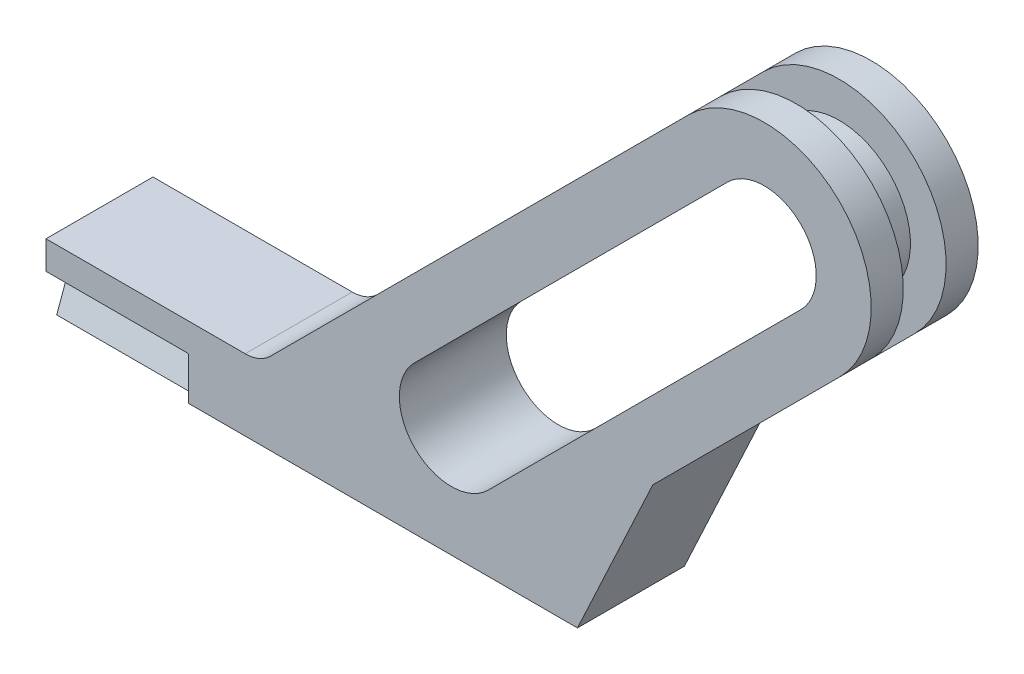
ISO-10303-21;
HEADER;
FILE_DESCRIPTION(('STEP AP214'),'2;1');
FILE_NAME('part.step','',(''),(''),'','','');
FILE_SCHEMA(('AUTOMOTIVE_DESIGN { 1 0 10303 214 1 1 1 1 }'));
ENDSEC;
DATA;
#1=APPLICATION_CONTEXT('core data for automotive mechanical design processes');
#2=APPLICATION_PROTOCOL_DEFINITION('international standard','automotive_design',2000,#1);
#3=PRODUCT_CONTEXT('',#1,'mechanical');
#4=PRODUCT('Part','Part','',(#3));
#5=PRODUCT_RELATED_PRODUCT_CATEGORY('part','',(#4));
#6=PRODUCT_DEFINITION_FORMATION('','',#4);
#7=PRODUCT_DEFINITION_CONTEXT('part definition',#1,'design');
#8=PRODUCT_DEFINITION('design','',#6,#7);
#9=PRODUCT_DEFINITION_SHAPE('','',#8);
#10=(LENGTH_UNIT() NAMED_UNIT(*) SI_UNIT(.MILLI.,.METRE.));
#11=(NAMED_UNIT(*) PLANE_ANGLE_UNIT() SI_UNIT($,.RADIAN.));
#12=(NAMED_UNIT(*) SI_UNIT($,.STERADIAN.) SOLID_ANGLE_UNIT());
#13=UNCERTAINTY_MEASURE_WITH_UNIT(LENGTH_MEASURE(1.E-05),#10,'distance_accuracy_value','');
#14=(GEOMETRIC_REPRESENTATION_CONTEXT(3) GLOBAL_UNCERTAINTY_ASSIGNED_CONTEXT((#13)) GLOBAL_UNIT_ASSIGNED_CONTEXT((#10,
#11,#12)) REPRESENTATION_CONTEXT('',''));
#15=CARTESIAN_POINT('',(0.,0.,0.));
#16=DIRECTION('',(0.,0.,1.));
#17=DIRECTION('',(1.,0.,0.));
#18=AXIS2_PLACEMENT_3D('',#15,#16,#17);
#19=CARTESIAN_POINT('',(-30.,-10.,15.));
#20=DIRECTION('',(1.,0.,0.));
#21=DIRECTION('',(0.,0.,-1.));
#22=AXIS2_PLACEMENT_3D('',#19,#20,#21);
#23=PLANE('',#22);
#24=DIRECTION('',(0.,0.,-1.));
#25=VECTOR('',#24,1.);
#26=CARTESIAN_POINT('',(-30.,-3.9555496771999,15.));
#27=LINE('',#26,#25);
#28=CARTESIAN_POINT('',(-30.,-3.9555496771999,15.));
#29=VERTEX_POINT('',#28);
#30=CARTESIAN_POINT('',(-30.,-3.9555496771999,11.5856296013484));
#31=VERTEX_POINT('',#30);
#32=EDGE_CURVE('E275',#29,#31,#27,.T.);
#33=ORIENTED_EDGE('',*,*,#32,.F.);
#34=DIRECTION('',(0.,-1.,0.));
#35=VECTOR('',#34,1.);
#36=CARTESIAN_POINT('',(-30.,-10.,15.));
#37=LINE('',#36,#35);
#38=CARTESIAN_POINT('',(-30.,0.,15.));
#39=VERTEX_POINT('',#38);
#40=EDGE_CURVE('E358',#39,#29,#37,.T.);
#41=ORIENTED_EDGE('',*,*,#40,.F.);
#42=DIRECTION('',(0.,0.,-1.));
#43=VECTOR('',#42,1.);
#44=CARTESIAN_POINT('',(-30.,0.,15.));
#45=LINE('',#44,#43);
#46=CARTESIAN_POINT('',(-30.,0.,0.));
#47=VERTEX_POINT('',#46);
#48=EDGE_CURVE('E425',#39,#47,#45,.T.);
#49=ORIENTED_EDGE('',*,*,#48,.T.);
#50=DIRECTION('',(0.,-1.,0.));
#51=VECTOR('',#50,1.);
#52=CARTESIAN_POINT('',(-30.,-10.,0.));
#53=LINE('',#52,#51);
#54=CARTESIAN_POINT('',(-30.,-3.9555496771999,0.));
#55=VERTEX_POINT('',#54);
#56=EDGE_CURVE('E381',#47,#55,#53,.T.);
#57=ORIENTED_EDGE('',*,*,#56,.T.);
#58=DIRECTION('',(0.,0.,-1.));
#59=VECTOR('',#58,1.);
#60=CARTESIAN_POINT('',(-30.,-3.9555496771999,0.));
#61=LINE('',#60,#59);
#62=CARTESIAN_POINT('',(-30.,-3.9555496771999,3.41437039865158));
#63=VERTEX_POINT('',#62);
#64=EDGE_CURVE('E277',#63,#55,#61,.T.);
#65=ORIENTED_EDGE('',*,*,#64,.F.);
#66=CARTESIAN_POINT('',(-30.,-4.15554967719989,3.41437039865158));
#67=DIRECTION('',(1.,0.,0.));
#68=DIRECTION('',(0.,0.,-1.));
#69=AXIS2_PLACEMENT_3D('',#66,#67,#68);
#70=CIRCLE('',#69,0.2);
#71=CARTESIAN_POINT('',(-30.,-4.22395370586503,3.60230892280876));
#72=VERTEX_POINT('',#71);
#73=EDGE_CURVE('E12',#63,#72,#70,.T.);
#74=ORIENTED_EDGE('',*,*,#73,.T.);
#75=DIRECTION('',(0.,0.939692620785908,0.34202014332567));
#76=VECTOR('',#75,1.);
#77=CARTESIAN_POINT('',(-30.,-3.9555496771999,3.7));
#78=LINE('',#77,#76);
#79=CARTESIAN_POINT('',(-30.,-10.,1.5));
#80=VERTEX_POINT('',#79);
#81=EDGE_CURVE('E290',#80,#72,#78,.T.);
#82=ORIENTED_EDGE('',*,*,#81,.F.);
#83=DIRECTION('',(0.,0.,-1.));
#84=VECTOR('',#83,1.);
#85=CARTESIAN_POINT('',(-30.,-10.,15.));
#86=LINE('',#85,#84);
#87=CARTESIAN_POINT('',(-30.,-10.,13.5));
#88=VERTEX_POINT('',#87);
#89=EDGE_CURVE('E420',#88,#80,#86,.T.);
#90=ORIENTED_EDGE('',*,*,#89,.F.);
#91=DIRECTION('',(0.,-0.939692620785908,0.34202014332567));
#92=VECTOR('',#91,1.);
#93=CARTESIAN_POINT('',(-30.,-3.9555496771999,11.3));
#94=LINE('',#93,#92);
#95=CARTESIAN_POINT('',(-30.,-4.22395370586503,11.3976910771912));
#96=VERTEX_POINT('',#95);
#97=EDGE_CURVE('E255',#96,#88,#94,.T.);
#98=ORIENTED_EDGE('',*,*,#97,.F.);
#99=CARTESIAN_POINT('',(-30.,-4.15554967719989,11.5856296013484));
#100=DIRECTION('',(1.,0.,0.));
#101=DIRECTION('',(0.,0.,-1.));
#102=AXIS2_PLACEMENT_3D('',#99,#100,#101);
#103=CIRCLE('',#102,0.2);
#104=EDGE_CURVE('E62',#96,#31,#103,.T.);
#105=ORIENTED_EDGE('',*,*,#104,.T.);
#106=EDGE_LOOP('',(#33,#41,#49,#57,#65,#74,#82,#90,#98,#105));
#107=FACE_BOUND('',#106,.T.);
#108=ADVANCED_FACE('F51',(#107),#23,.F.);
#109=CARTESIAN_POINT('',(70.7106781186547,49.4974746830585,15.));
#110=DIRECTION('',(0.,0.,-1.));
#111=DIRECTION('',(-1.,0.,0.));
#112=AXIS2_PLACEMENT_3D('',#109,#110,#111);
#113=PLANE('',#112);
#114=DIRECTION('',(-0.707106781186556,-0.707106781186539,0.));
#115=VECTOR('',#114,1.);
#116=CARTESIAN_POINT('',(65.5539139351157,54.6542388665975,15.));
#117=LINE('',#116,#115);
#118=CARTESIAN_POINT('',(65.5539139351157,54.6542388665975,15.));
#119=VERTEX_POINT('',#118);
#120=CARTESIAN_POINT('',(21.6784654097394,10.7787903412224,15.));
#121=VERTEX_POINT('',#120);
#122=EDGE_CURVE('E302',#119,#121,#117,.T.);
#123=ORIENTED_EDGE('',*,*,#122,.F.);
#124=CARTESIAN_POINT('',(70.7106781186547,49.4974746830585,15.));
#125=DIRECTION('',(0.,0.,-1.));
#126=DIRECTION('',(-1.,0.,0.));
#127=AXIS2_PLACEMENT_3D('',#124,#125,#126);
#128=CIRCLE('',#127,7.29276584632071);
#129=CARTESIAN_POINT('',(75.8674423021936,44.3407104995194,15.));
#130=VERTEX_POINT('',#129);
#131=EDGE_CURVE('E306',#130,#119,#128,.F.);
#132=ORIENTED_EDGE('',*,*,#131,.F.);
#133=DIRECTION('',(0.707106781186556,0.707106781186539,0.));
#134=VECTOR('',#133,1.);
#135=CARTESIAN_POINT('',(75.8674423021936,44.3407104995194,15.));
#136=LINE('',#135,#134);
#137=CARTESIAN_POINT('',(31.9919937768173,0.46526197414417,15.));
#138=VERTEX_POINT('',#137);
#139=EDGE_CURVE('E332',#138,#130,#136,.T.);
#140=ORIENTED_EDGE('',*,*,#139,.F.);
#141=CARTESIAN_POINT('',(26.8352295932784,5.62202615768326,15.));
#142=DIRECTION('',(0.,0.,-1.));
#143=DIRECTION('',(-1.,0.,0.));
#144=AXIS2_PLACEMENT_3D('',#141,#142,#143);
#145=CIRCLE('',#144,7.29276584632071);
#146=EDGE_CURVE('E259',#121,#138,#145,.F.);
#147=ORIENTED_EDGE('',*,*,#146,.F.);
#148=EDGE_LOOP('',(#123,#132,#140,#147));
#149=FACE_BOUND('',#148,.T.);
#150=DIRECTION('',(0.,1.,0.));
#151=VECTOR('',#150,1.);
#152=CARTESIAN_POINT('',(-10.,-10.,15.));
#153=LINE('',#152,#151);
#154=CARTESIAN_POINT('',(-10.,-10.,15.));
#155=VERTEX_POINT('',#154);
#156=CARTESIAN_POINT('',(-10.,-4.15554967719989,15.));
#157=VERTEX_POINT('',#156);
#158=EDGE_CURVE('E247',#155,#157,#153,.T.);
#159=ORIENTED_EDGE('',*,*,#158,.F.);
#160=DIRECTION('',(1.,0.,0.));
#161=VECTOR('',#160,1.);
#162=CARTESIAN_POINT('',(44.5186450035915,-10.0000000000001,15.));
#163=LINE('',#162,#161);
#164=CARTESIAN_POINT('',(44.5186450035915,-10.0000000000001,15.));
#165=VERTEX_POINT('',#164);
#166=EDGE_CURVE('E264',#155,#165,#163,.T.);
#167=ORIENTED_EDGE('',*,*,#166,.T.);
#168=DIRECTION('',(0.422618261740696,0.906307787036651,0.));
#169=VECTOR('',#168,1.);
#170=CARTESIAN_POINT('',(55.084101547109,12.6576946759162,15.));
#171=LINE('',#170,#169);
#172=CARTESIAN_POINT('',(55.084101547109,12.6576946759162,15.));
#173=VERTEX_POINT('',#172);
#174=EDGE_CURVE('E364',#165,#173,#171,.T.);
#175=ORIENTED_EDGE('',*,*,#174,.T.);
#176=DIRECTION('',(0.707106781186546,0.707106781186549,0.));
#177=VECTOR('',#176,1.);
#178=CARTESIAN_POINT('',(81.3172798364529,38.8908729652603,15.));
#179=LINE('',#178,#177);
#180=CARTESIAN_POINT('',(81.3172798364529,38.8908729652603,15.));
#181=VERTEX_POINT('',#180);
#182=EDGE_CURVE('E366',#173,#181,#179,.T.);
#183=ORIENTED_EDGE('',*,*,#182,.T.);
#184=CARTESIAN_POINT('',(70.7106781186547,49.4974746830585,15.));
#185=DIRECTION('',(0.,0.,1.));
#186=DIRECTION('',(-1.,0.,0.));
#187=AXIS2_PLACEMENT_3D('',#184,#185,#186);
#188=CIRCLE('',#187,15.);
#189=CARTESIAN_POINT('',(60.1040764008564,60.1040764008567,15.));
#190=VERTEX_POINT('',#189);
#191=EDGE_CURVE('E371',#181,#190,#188,.T.);
#192=ORIENTED_EDGE('',*,*,#191,.T.);
#193=DIRECTION('',(-0.707106781186546,-0.707106781186549,0.));
#194=VECTOR('',#193,1.);
#195=CARTESIAN_POINT('',(0.,0.,15.));
#196=LINE('',#195,#194);
#197=CARTESIAN_POINT('',(1.46446609406726,1.46446609406727,15.));
#198=VERTEX_POINT('',#197);
#199=EDGE_CURVE('E372',#190,#198,#196,.T.);
#200=ORIENTED_EDGE('',*,*,#199,.T.);
#201=CARTESIAN_POINT('',(-2.07106781186548,5.,15.));
#202=DIRECTION('',(0.,0.,-1.));
#203=DIRECTION('',(-1.,0.,0.));
#204=AXIS2_PLACEMENT_3D('',#201,#202,#203);
#205=CIRCLE('',#204,5.);
#206=CARTESIAN_POINT('',(-2.07106781186548,0.,15.));
#207=VERTEX_POINT('',#206);
#208=EDGE_CURVE('E436',#198,#207,#205,.T.);
#209=ORIENTED_EDGE('',*,*,#208,.T.);
#210=DIRECTION('',(-1.,0.,0.));
#211=VECTOR('',#210,1.);
#212=CARTESIAN_POINT('',(-30.,0.,15.));
#213=LINE('',#212,#211);
#214=EDGE_CURVE('E351',#207,#39,#213,.T.);
#215=ORIENTED_EDGE('',*,*,#214,.T.);
#216=ORIENTED_EDGE('',*,*,#40,.T.);
#217=DIRECTION('',(-1.,0.,0.));
#218=VECTOR('',#217,1.);
#219=CARTESIAN_POINT('',(-10.,-3.9555496771999,15.));
#220=LINE('',#219,#218);
#221=CARTESIAN_POINT('',(-10.2,-3.9555496771999,15.));
#222=VERTEX_POINT('',#221);
#223=EDGE_CURVE('E257',#222,#29,#220,.T.);
#224=ORIENTED_EDGE('',*,*,#223,.F.);
#225=CARTESIAN_POINT('',(-10.2,-4.15554967719989,15.));
#226=DIRECTION('',(0.,0.,-1.));
#227=DIRECTION('',(-1.,0.,0.));
#228=AXIS2_PLACEMENT_3D('',#225,#226,#227);
#229=CIRCLE('',#228,0.2);
#230=EDGE_CURVE('E610',#222,#157,#229,.T.);
#231=ORIENTED_EDGE('',*,*,#230,.T.);
#232=EDGE_LOOP('',(#159,#167,#175,#183,#192,#200,#209,#215,#216,#224,#231));
#233=FACE_BOUND('',#232,.T.);
#234=ADVANCED_FACE('F474',(#149,#233),#113,.F.);
#235=CARTESIAN_POINT('',(70.7106781186547,49.4974746830585,0.));
#236=DIRECTION('',(0.,0.,-1.));
#237=DIRECTION('',(-1.,0.,0.));
#238=AXIS2_PLACEMENT_3D('',#235,#236,#237);
#239=PLANE('',#238);
#240=CARTESIAN_POINT('',(70.7106781186547,49.4974746830585,0.));
#241=DIRECTION('',(0.,0.,-1.));
#242=DIRECTION('',(-1.,0.,0.));
#243=AXIS2_PLACEMENT_3D('',#240,#241,#242);
#244=CIRCLE('',#243,7.29276584632071);
#245=CARTESIAN_POINT('',(65.5539139351157,54.6542388665975,0.));
#246=VERTEX_POINT('',#245);
#247=CARTESIAN_POINT('',(75.8674423021936,44.3407104995194,0.));
#248=VERTEX_POINT('',#247);
#249=EDGE_CURVE('E315',#246,#248,#244,.T.);
#250=ORIENTED_EDGE('',*,*,#249,.F.);
#251=DIRECTION('',(0.707106781186556,0.707106781186539,0.));
#252=VECTOR('',#251,1.);
#253=CARTESIAN_POINT('',(65.5539139351157,54.6542388665975,0.));
#254=LINE('',#253,#252);
#255=CARTESIAN_POINT('',(21.6784654097394,10.7787903412224,0.));
#256=VERTEX_POINT('',#255);
#257=EDGE_CURVE('E323',#256,#246,#254,.T.);
#258=ORIENTED_EDGE('',*,*,#257,.F.);
#259=CARTESIAN_POINT('',(26.8352295932784,5.62202615768326,0.));
#260=DIRECTION('',(0.,0.,-1.));
#261=DIRECTION('',(-1.,0.,0.));
#262=AXIS2_PLACEMENT_3D('',#259,#260,#261);
#263=CIRCLE('',#262,7.29276584632071);
#264=CARTESIAN_POINT('',(31.9919937768173,0.465261974144174,0.));
#265=VERTEX_POINT('',#264);
#266=EDGE_CURVE('E317',#265,#256,#263,.T.);
#267=ORIENTED_EDGE('',*,*,#266,.F.);
#268=DIRECTION('',(-0.707106781186556,-0.707106781186539,0.));
#269=VECTOR('',#268,1.);
#270=CARTESIAN_POINT('',(75.8674423021936,44.3407104995194,0.));
#271=LINE('',#270,#269);
#272=EDGE_CURVE('E312',#248,#265,#271,.T.);
#273=ORIENTED_EDGE('',*,*,#272,.F.);
#274=EDGE_LOOP('',(#250,#258,#267,#273));
#275=FACE_BOUND('',#274,.T.);
#276=DIRECTION('',(0.,-1.,0.));
#277=VECTOR('',#276,1.);
#278=CARTESIAN_POINT('',(-10.,-10.,0.));
#279=LINE('',#278,#277);
#280=CARTESIAN_POINT('',(-10.,-4.15554967719989,0.));
#281=VERTEX_POINT('',#280);
#282=CARTESIAN_POINT('',(-10.,-10.,0.));
#283=VERTEX_POINT('',#282);
#284=EDGE_CURVE('E289',#281,#283,#279,.T.);
#285=ORIENTED_EDGE('',*,*,#284,.F.);
#286=CARTESIAN_POINT('',(-10.2,-4.15554967719989,0.));
#287=DIRECTION('',(0.,0.,-1.));
#288=DIRECTION('',(-1.,0.,0.));
#289=AXIS2_PLACEMENT_3D('',#286,#287,#288);
#290=CIRCLE('',#289,0.2);
#291=CARTESIAN_POINT('',(-10.2,-3.9555496771999,0.));
#292=VERTEX_POINT('',#291);
#293=EDGE_CURVE('E603',#281,#292,#290,.F.);
#294=ORIENTED_EDGE('',*,*,#293,.T.);
#295=DIRECTION('',(-1.,0.,0.));
#296=VECTOR('',#295,1.);
#297=CARTESIAN_POINT('',(-10.,-3.9555496771999,0.));
#298=LINE('',#297,#296);
#299=EDGE_CURVE('E276',#292,#55,#298,.T.);
#300=ORIENTED_EDGE('',*,*,#299,.T.);
#301=ORIENTED_EDGE('',*,*,#56,.F.);
#302=DIRECTION('',(-1.,0.,0.));
#303=VECTOR('',#302,1.);
#304=CARTESIAN_POINT('',(-30.,0.,0.));
#305=LINE('',#304,#303);
#306=CARTESIAN_POINT('',(-2.07106781186548,0.,0.));
#307=VERTEX_POINT('',#306);
#308=EDGE_CURVE('E354',#307,#47,#305,.T.);
#309=ORIENTED_EDGE('',*,*,#308,.F.);
#310=CARTESIAN_POINT('',(-2.07106781186548,5.,0.));
#311=DIRECTION('',(0.,0.,-1.));
#312=DIRECTION('',(-1.,0.,0.));
#313=AXIS2_PLACEMENT_3D('',#310,#311,#312);
#314=CIRCLE('',#313,5.);
#315=CARTESIAN_POINT('',(1.46446609406726,1.46446609406727,0.));
#316=VERTEX_POINT('',#315);
#317=EDGE_CURVE('E433',#307,#316,#314,.F.);
#318=ORIENTED_EDGE('',*,*,#317,.T.);
#319=DIRECTION('',(-0.707106781186546,-0.707106781186549,0.));
#320=VECTOR('',#319,1.);
#321=CARTESIAN_POINT('',(0.,0.,0.));
#322=LINE('',#321,#320);
#323=CARTESIAN_POINT('',(60.1040764008564,60.1040764008567,0.));
#324=VERTEX_POINT('',#323);
#325=EDGE_CURVE('E357',#324,#316,#322,.T.);
#326=ORIENTED_EDGE('',*,*,#325,.F.);
#327=CARTESIAN_POINT('',(70.7106781186547,49.4974746830585,0.));
#328=DIRECTION('',(0.,0.,1.));
#329=DIRECTION('',(-1.,0.,0.));
#330=AXIS2_PLACEMENT_3D('',#327,#328,#329);
#331=CIRCLE('',#330,15.);
#332=CARTESIAN_POINT('',(81.3172798364529,38.8908729652603,0.));
#333=VERTEX_POINT('',#332);
#334=EDGE_CURVE('E391',#333,#324,#331,.T.);
#335=ORIENTED_EDGE('',*,*,#334,.F.);
#336=DIRECTION('',(0.707106781186546,0.707106781186549,0.));
#337=VECTOR('',#336,1.);
#338=CARTESIAN_POINT('',(81.3172798364529,38.8908729652603,0.));
#339=LINE('',#338,#337);
#340=CARTESIAN_POINT('',(55.084101547109,12.6576946759162,0.));
#341=VERTEX_POINT('',#340);
#342=EDGE_CURVE('E392',#341,#333,#339,.T.);
#343=ORIENTED_EDGE('',*,*,#342,.F.);
#344=DIRECTION('',(0.422618261740696,0.906307787036651,0.));
#345=VECTOR('',#344,1.);
#346=CARTESIAN_POINT('',(55.084101547109,12.6576946759162,0.));
#347=LINE('',#346,#345);
#348=CARTESIAN_POINT('',(44.5186450035915,-10.0000000000001,0.));
#349=VERTEX_POINT('',#348);
#350=EDGE_CURVE('E389',#349,#341,#347,.T.);
#351=ORIENTED_EDGE('',*,*,#350,.F.);
#352=DIRECTION('',(1.,0.,0.));
#353=VECTOR('',#352,1.);
#354=CARTESIAN_POINT('',(44.5186450035915,-10.0000000000001,0.));
#355=LINE('',#354,#353);
#356=EDGE_CURVE('E384',#283,#349,#355,.T.);
#357=ORIENTED_EDGE('',*,*,#356,.F.);
#358=EDGE_LOOP('',(#285,#294,#300,#301,#309,#318,#326,#335,#343,#351,#357));
#359=FACE_BOUND('',#358,.T.);
#360=ADVANCED_FACE('F472',(#275,#359),#239,.T.);
#361=CARTESIAN_POINT('',(44.5186450035915,-10.0000000000001,15.));
#362=DIRECTION('',(0.,1.,0.));
#363=DIRECTION('',(-1.,0.,0.));
#364=AXIS2_PLACEMENT_3D('',#361,#362,#363);
#365=PLANE('',#364);
#366=DIRECTION('',(0.,0.,1.));
#367=VECTOR('',#366,1.);
#368=CARTESIAN_POINT('',(-10.,-10.,13.5));
#369=LINE('',#368,#367);
#370=CARTESIAN_POINT('',(-10.,-10.,13.5));
#371=VERTEX_POINT('',#370);
#372=EDGE_CURVE('E243',#371,#155,#369,.T.);
#373=ORIENTED_EDGE('',*,*,#372,.F.);
#374=DIRECTION('',(-1.,0.,0.));
#375=VECTOR('',#374,1.);
#376=CARTESIAN_POINT('',(-10.,-10.,13.5));
#377=LINE('',#376,#375);
#378=EDGE_CURVE('E252',#371,#88,#377,.T.);
#379=ORIENTED_EDGE('',*,*,#378,.T.);
#380=ORIENTED_EDGE('',*,*,#89,.T.);
#381=DIRECTION('',(-1.,0.,0.));
#382=VECTOR('',#381,1.);
#383=CARTESIAN_POINT('',(-10.,-10.,1.5));
#384=LINE('',#383,#382);
#385=CARTESIAN_POINT('',(-10.,-10.,1.5));
#386=VERTEX_POINT('',#385);
#387=EDGE_CURVE('E283',#386,#80,#384,.T.);
#388=ORIENTED_EDGE('',*,*,#387,.F.);
#389=DIRECTION('',(0.,0.,1.));
#390=VECTOR('',#389,1.);
#391=CARTESIAN_POINT('',(-10.,-10.,1.5));
#392=LINE('',#391,#390);
#393=EDGE_CURVE('E300',#283,#386,#392,.T.);
#394=ORIENTED_EDGE('',*,*,#393,.F.);
#395=ORIENTED_EDGE('',*,*,#356,.T.);
#396=DIRECTION('',(0.,0.,-1.));
#397=VECTOR('',#396,1.);
#398=CARTESIAN_POINT('',(44.5186450035915,-10.0000000000001,15.));
#399=LINE('',#398,#397);
#400=EDGE_CURVE('E414',#165,#349,#399,.T.);
#401=ORIENTED_EDGE('',*,*,#400,.F.);
#402=ORIENTED_EDGE('',*,*,#166,.F.);
#403=EDGE_LOOP('',(#373,#379,#380,#388,#394,#395,#401,#402));
#404=FACE_BOUND('',#403,.T.);
#405=ADVANCED_FACE('F263',(#404),#365,.F.);
#406=CARTESIAN_POINT('',(70.7106781186547,49.4974746830585,15.));
#407=DIRECTION('',(0.,0.,-1.));
#408=DIRECTION('',(-1.,0.,0.));
#409=AXIS2_PLACEMENT_3D('',#406,#407,#408);
#410=CYLINDRICAL_SURFACE('',#409,15.);
#411=DIRECTION('',(0.,0.,-1.));
#412=VECTOR('',#411,1.);
#413=CARTESIAN_POINT('',(60.1040764008564,60.1040764008567,15.));
#414=LINE('',#413,#412);
#415=CARTESIAN_POINT('',(60.1040764008564,60.1040764008567,4.5));
#416=VERTEX_POINT('',#415);
#417=EDGE_CURVE('E378',#416,#324,#414,.T.);
#418=ORIENTED_EDGE('',*,*,#417,.F.);
#419=CARTESIAN_POINT('',(70.7106781186547,49.4974746830585,4.5));
#420=DIRECTION('',(0.,0.,-1.));
#421=DIRECTION('',(-1.,0.,0.));
#422=AXIS2_PLACEMENT_3D('',#419,#420,#421);
#423=CIRCLE('',#422,15.);
#424=CARTESIAN_POINT('',(81.3172798364529,38.8908729652602,4.5));
#425=VERTEX_POINT('',#424);
#426=EDGE_CURVE('E349',#416,#425,#423,.T.);
#427=ORIENTED_EDGE('',*,*,#426,.T.);
#428=DIRECTION('',(0.,0.,-1.));
#429=VECTOR('',#428,1.);
#430=CARTESIAN_POINT('',(81.3172798364529,38.8908729652603,15.));
#431=LINE('',#430,#429);
#432=EDGE_CURVE('E407',#425,#333,#431,.T.);
#433=ORIENTED_EDGE('',*,*,#432,.T.);
#434=ORIENTED_EDGE('',*,*,#334,.T.);
#435=EDGE_LOOP('',(#418,#427,#433,#434));
#436=FACE_BOUND('',#435,.T.);
#437=ADVANCED_FACE('F473',(#436),#410,.T.);
#438=CARTESIAN_POINT('',(-30.,0.,15.));
#439=DIRECTION('',(0.,-1.,0.));
#440=DIRECTION('',(0.,0.,-1.));
#441=AXIS2_PLACEMENT_3D('',#438,#439,#440);
#442=PLANE('',#441);
#443=ORIENTED_EDGE('',*,*,#214,.F.);
#444=DIRECTION('',(0.,0.,-1.));
#445=VECTOR('',#444,1.);
#446=CARTESIAN_POINT('',(-2.07106781186548,0.,0.));
#447=LINE('',#446,#445);
#448=EDGE_CURVE('E426',#207,#307,#447,.T.);
#449=ORIENTED_EDGE('',*,*,#448,.T.);
#450=ORIENTED_EDGE('',*,*,#308,.T.);
#451=ORIENTED_EDGE('',*,*,#48,.F.);
#452=EDGE_LOOP('',(#443,#449,#450,#451));
#453=FACE_BOUND('',#452,.T.);
#454=ADVANCED_FACE('F470',(#453),#442,.F.);
#455=CARTESIAN_POINT('',(55.084101547109,12.6576946759162,15.));
#456=DIRECTION('',(-0.906307787036651,0.422618261740696,0.));
#457=DIRECTION('',(-0.422618261740696,-0.906307787036652,0.));
#458=AXIS2_PLACEMENT_3D('',#455,#456,#457);
#459=PLANE('',#458);
#460=ORIENTED_EDGE('',*,*,#350,.T.);
#461=DIRECTION('',(0.,0.,-1.));
#462=VECTOR('',#461,1.);
#463=CARTESIAN_POINT('',(55.084101547109,12.6576946759162,15.));
#464=LINE('',#463,#462);
#465=EDGE_CURVE('E411',#173,#341,#464,.T.);
#466=ORIENTED_EDGE('',*,*,#465,.F.);
#467=ORIENTED_EDGE('',*,*,#174,.F.);
#468=ORIENTED_EDGE('',*,*,#400,.T.);
#469=EDGE_LOOP('',(#460,#466,#467,#468));
#470=FACE_BOUND('',#469,.T.);
#471=ADVANCED_FACE('F463',(#470),#459,.F.);
#472=CARTESIAN_POINT('',(81.3172798364529,38.8908729652603,15.));
#473=DIRECTION('',(-0.707106781186549,0.707106781186546,0.));
#474=DIRECTION('',(-0.707106781186546,-0.707106781186549,0.));
#475=AXIS2_PLACEMENT_3D('',#472,#473,#474);
#476=PLANE('',#475);
#477=ORIENTED_EDGE('',*,*,#432,.F.);
#478=DIRECTION('',(-0.707106781186546,-0.707106781186549,0.));
#479=VECTOR('',#478,1.);
#480=CARTESIAN_POINT('',(81.3172798364529,38.8908729652603,4.5));
#481=LINE('',#480,#479);
#482=CARTESIAN_POINT('',(75.193555479495,32.7671486083023,4.5));
#483=VERTEX_POINT('',#482);
#484=EDGE_CURVE('E738',#425,#483,#481,.T.);
#485=ORIENTED_EDGE('',*,*,#484,.T.);
#486=CARTESIAN_POINT('',(75.1935554794949,32.7671486083023,10.8));
#487=CARTESIAN_POINT('',(75.1935554794949,32.7671486083023,8.6));
#488=CARTESIAN_POINT('',(75.1935554794949,32.7671486083023,6.4));
#489=CARTESIAN_POINT('',(75.1935554794949,32.7671486083023,4.2));
#490=(BOUNDED_CURVE() B_SPLINE_CURVE(3,(#486,#487,#488,#489),.UNSPECIFIED.,.F.,
.F.) B_SPLINE_CURVE_WITH_KNOTS((4,4),(0.0042,0.0108),
.UNSPECIFIED.) CURVE() GEOMETRIC_REPRESENTATION_ITEM() RATIONAL_B_SPLINE_CURVE((1.,1.,1.,1.)) REPRESENTATION_ITEM(''));
#491=CARTESIAN_POINT('',(75.1935554794949,32.7671486083023,10.5));
#492=VERTEX_POINT('',#491);
#493=EDGE_CURVE('E443',#483,#492,#490,.F.);
#494=ORIENTED_EDGE('',*,*,#493,.T.);
#495=DIRECTION('',(0.707106781186546,0.707106781186549,0.));
#496=VECTOR('',#495,1.);
#497=CARTESIAN_POINT('',(81.3172798364529,38.8908729652603,10.5));
#498=LINE('',#497,#496);
#499=CARTESIAN_POINT('',(81.3172798364529,38.8908729652602,10.5));
#500=VERTEX_POINT('',#499);
#501=EDGE_CURVE('E438',#492,#500,#498,.T.);
#502=ORIENTED_EDGE('',*,*,#501,.T.);
#503=EDGE_CURVE('E410',#181,#500,#431,.T.);
#504=ORIENTED_EDGE('',*,*,#503,.F.);
#505=ORIENTED_EDGE('',*,*,#182,.F.);
#506=ORIENTED_EDGE('',*,*,#465,.T.);
#507=ORIENTED_EDGE('',*,*,#342,.T.);
#508=EDGE_LOOP('',(#477,#485,#494,#502,#504,#505,#506,#507));
#509=FACE_BOUND('',#508,.T.);
#510=ADVANCED_FACE('F455',(#509),#476,.F.);
#511=ORIENTED_EDGE('',*,*,#503,.T.);
#512=CARTESIAN_POINT('',(70.7106781186547,49.4974746830585,10.5));
#513=DIRECTION('',(0.,0.,1.));
#514=DIRECTION('',(1.,0.,0.));
#515=AXIS2_PLACEMENT_3D('',#512,#513,#514);
#516=CIRCLE('',#515,15.);
#517=CARTESIAN_POINT('',(60.1040764008564,60.1040764008567,10.5));
#518=VERTEX_POINT('',#517);
#519=EDGE_CURVE('E344',#500,#518,#516,.T.);
#520=ORIENTED_EDGE('',*,*,#519,.T.);
#521=EDGE_CURVE('E405',#190,#518,#414,.T.);
#522=ORIENTED_EDGE('',*,*,#521,.F.);
#523=ORIENTED_EDGE('',*,*,#191,.F.);
#524=EDGE_LOOP('',(#511,#520,#522,#523));
#525=FACE_BOUND('',#524,.T.);
#526=ADVANCED_FACE('F465',(#525),#410,.T.);
#527=CARTESIAN_POINT('',(0.,0.,15.));
#528=DIRECTION('',(0.707106781186549,-0.707106781186546,0.));
#529=DIRECTION('',(0.707106781186546,0.707106781186549,0.));
#530=AXIS2_PLACEMENT_3D('',#527,#528,#529);
#531=PLANE('',#530);
#532=CARTESIAN_POINT('',(53.9803520438985,53.9803520438987,4.2));
#533=CARTESIAN_POINT('',(53.9803520438985,53.9803520438987,6.4));
#534=CARTESIAN_POINT('',(53.9803520438985,53.9803520438987,8.6));
#535=CARTESIAN_POINT('',(53.9803520438985,53.9803520438987,10.8));
#536=(BOUNDED_CURVE() B_SPLINE_CURVE(3,(#532,#533,#534,#535),.UNSPECIFIED.,.F.,
.F.) B_SPLINE_CURVE_WITH_KNOTS((4,4),(0.0042,0.0108),
.UNSPECIFIED.) CURVE() GEOMETRIC_REPRESENTATION_ITEM() RATIONAL_B_SPLINE_CURVE((1.,1.,1.,1.)) REPRESENTATION_ITEM(''));
#537=CARTESIAN_POINT('',(53.9803520438985,53.9803520438987,10.5));
#538=VERTEX_POINT('',#537);
#539=CARTESIAN_POINT('',(53.9803520438985,53.9803520438987,4.5));
#540=VERTEX_POINT('',#539);
#541=EDGE_CURVE('E740',#538,#540,#536,.F.);
#542=ORIENTED_EDGE('',*,*,#541,.T.);
#543=DIRECTION('',(0.707106781186546,0.707106781186549,0.));
#544=VECTOR('',#543,1.);
#545=CARTESIAN_POINT('',(0.,0.,4.5));
#546=LINE('',#545,#544);
#547=EDGE_CURVE('E741',#540,#416,#546,.T.);
#548=ORIENTED_EDGE('',*,*,#547,.T.);
#549=ORIENTED_EDGE('',*,*,#417,.T.);
#550=ORIENTED_EDGE('',*,*,#325,.T.);
#551=DIRECTION('',(0.,0.,-1.));
#552=VECTOR('',#551,1.);
#553=CARTESIAN_POINT('',(1.46446609406726,1.46446609406727,15.));
#554=LINE('',#553,#552);
#555=EDGE_CURVE('E429',#316,#198,#554,.F.);
#556=ORIENTED_EDGE('',*,*,#555,.T.);
#557=ORIENTED_EDGE('',*,*,#199,.F.);
#558=ORIENTED_EDGE('',*,*,#521,.T.);
#559=DIRECTION('',(-0.707106781186546,-0.707106781186549,0.));
#560=VECTOR('',#559,1.);
#561=CARTESIAN_POINT('',(0.,0.,10.5));
#562=LINE('',#561,#560);
#563=EDGE_CURVE('E727',#518,#538,#562,.T.);
#564=ORIENTED_EDGE('',*,*,#563,.T.);
#565=EDGE_LOOP('',(#542,#548,#549,#550,#556,#557,#558,#564));
#566=FACE_BOUND('',#565,.T.);
#567=ADVANCED_FACE('F483',(#566),#531,.F.);
#568=CARTESIAN_POINT('',(-2.07106781186548,5.,15.));
#569=DIRECTION('',(0.,0.,1.));
#570=DIRECTION('',(1.,0.,0.));
#571=AXIS2_PLACEMENT_3D('',#568,#569,#570);
#572=CYLINDRICAL_SURFACE('',#571,5.);
#573=ORIENTED_EDGE('',*,*,#208,.F.);
#574=ORIENTED_EDGE('',*,*,#555,.F.);
#575=ORIENTED_EDGE('',*,*,#317,.F.);
#576=ORIENTED_EDGE('',*,*,#448,.F.);
#577=EDGE_LOOP('',(#573,#574,#575,#576));
#578=FACE_BOUND('',#577,.T.);
#579=ADVANCED_FACE('F479',(#578),#572,.F.);
#580=CARTESIAN_POINT('',(84.8528137423856,35.3553390593275,4.5));
#581=DIRECTION('',(0.,0.,-1.));
#582=DIRECTION('',(-1.,0.,0.));
#583=AXIS2_PLACEMENT_3D('',#580,#581,#582);
#584=PLANE('',#583);
#585=ORIENTED_EDGE('',*,*,#426,.F.);
#586=ORIENTED_EDGE('',*,*,#547,.F.);
#587=CARTESIAN_POINT('',(63.6396103067892,56.5685424949239,4.5));
#588=CARTESIAN_POINT('',(58.0628349485371,58.0628349485373,4.5));
#589=CARTESIAN_POINT('',(53.9803520438985,53.9803520438987,4.5));
#590=(BOUNDED_CURVE() B_SPLINE_CURVE(2,(#587,#588,#589),.UNSPECIFIED.,.F.,
.F.) B_SPLINE_CURVE_WITH_KNOTS((3,3),(0.,1.),
.UNSPECIFIED.) CURVE() GEOMETRIC_REPRESENTATION_ITEM() RATIONAL_B_SPLINE_CURVE((1.,
0.111111111111111,1.)) REPRESENTATION_ITEM(''));
#591=CARTESIAN_POINT('',(63.6396103067892,56.5685424949239,4.5));
#592=VERTEX_POINT('',#591);
#593=EDGE_CURVE('E781',#540,#592,#590,.F.);
#594=ORIENTED_EDGE('',*,*,#593,.T.);
#595=CARTESIAN_POINT('',(70.7106781186547,49.4974746830585,4.5));
#596=DIRECTION('',(0.,0.,1.));
#597=DIRECTION('',(0.707106781186547,-0.707106781186547,0.));
#598=AXIS2_PLACEMENT_3D('',#595,#596,#597);
#599=CIRCLE('',#598,10.);
#600=CARTESIAN_POINT('',(77.7817459305201,42.426406871193,4.5));
#601=VERTEX_POINT('',#600);
#602=EDGE_CURVE('E755',#601,#592,#599,.T.);
#603=ORIENTED_EDGE('',*,*,#602,.F.);
#604=CARTESIAN_POINT('',(75.1935554794949,32.7671486083023,4.5));
#605=CARTESIAN_POINT('',(79.2760383841336,36.8496315129409,4.5));
#606=CARTESIAN_POINT('',(77.7817459305201,42.426406871193,4.5));
#607=(BOUNDED_CURVE() B_SPLINE_CURVE(2,(#604,#605,#606),.UNSPECIFIED.,.F.,
.F.) B_SPLINE_CURVE_WITH_KNOTS((3,3),(0.,1.),
.UNSPECIFIED.) CURVE() GEOMETRIC_REPRESENTATION_ITEM() RATIONAL_B_SPLINE_CURVE((1.,
0.111111111111111,1.)) REPRESENTATION_ITEM(''));
#608=EDGE_CURVE('E742',#601,#483,#607,.F.);
#609=ORIENTED_EDGE('',*,*,#608,.T.);
#610=ORIENTED_EDGE('',*,*,#484,.F.);
#611=EDGE_LOOP('',(#585,#586,#594,#603,#609,#610));
#612=FACE_BOUND('',#611,.T.);
#613=ADVANCED_FACE('F485',(#612),#584,.F.);
#614=CARTESIAN_POINT('',(84.8528137423856,35.3553390593275,10.5));
#615=DIRECTION('',(0.,0.,1.));
#616=DIRECTION('',(1.,0.,0.));
#617=AXIS2_PLACEMENT_3D('',#614,#615,#616);
#618=PLANE('',#617);
#619=ORIENTED_EDGE('',*,*,#519,.F.);
#620=ORIENTED_EDGE('',*,*,#501,.F.);
#621=CARTESIAN_POINT('',(77.7817459305201,42.426406871193,10.5));
#622=CARTESIAN_POINT('',(79.2760383841336,36.8496315129409,10.5));
#623=CARTESIAN_POINT('',(75.1935554794949,32.7671486083023,10.5));
#624=(BOUNDED_CURVE() B_SPLINE_CURVE(2,(#621,#622,#623),.UNSPECIFIED.,.F.,
.F.) B_SPLINE_CURVE_WITH_KNOTS((3,3),(0.,1.),
.UNSPECIFIED.) CURVE() GEOMETRIC_REPRESENTATION_ITEM() RATIONAL_B_SPLINE_CURVE((1.,
0.111111111111111,1.)) REPRESENTATION_ITEM(''));
#625=CARTESIAN_POINT('',(77.7817459305201,42.426406871193,10.5));
#626=VERTEX_POINT('',#625);
#627=EDGE_CURVE('E766',#492,#626,#624,.F.);
#628=ORIENTED_EDGE('',*,*,#627,.T.);
#629=CARTESIAN_POINT('',(70.7106781186547,49.4974746830585,10.5));
#630=DIRECTION('',(0.,0.,1.));
#631=DIRECTION('',(0.707106781186547,-0.707106781186547,0.));
#632=AXIS2_PLACEMENT_3D('',#629,#630,#631);
#633=CIRCLE('',#632,10.);
#634=CARTESIAN_POINT('',(63.6396103067892,56.5685424949239,10.5));
#635=VERTEX_POINT('',#634);
#636=EDGE_CURVE('E348',#626,#635,#633,.T.);
#637=ORIENTED_EDGE('',*,*,#636,.T.);
#638=CARTESIAN_POINT('',(53.9803520438985,53.9803520438987,10.5));
#639=CARTESIAN_POINT('',(58.0628349485371,58.0628349485373,10.5));
#640=CARTESIAN_POINT('',(63.6396103067892,56.5685424949239,10.5));
#641=(BOUNDED_CURVE() B_SPLINE_CURVE(2,(#638,#639,#640),.UNSPECIFIED.,.F.,
.F.) B_SPLINE_CURVE_WITH_KNOTS((3,3),(0.,1.),
.UNSPECIFIED.) CURVE() GEOMETRIC_REPRESENTATION_ITEM() RATIONAL_B_SPLINE_CURVE((1.,
0.111111111111111,1.)) REPRESENTATION_ITEM(''));
#642=EDGE_CURVE('E578',#635,#538,#641,.F.);
#643=ORIENTED_EDGE('',*,*,#642,.T.);
#644=ORIENTED_EDGE('',*,*,#563,.F.);
#645=EDGE_LOOP('',(#619,#620,#628,#637,#643,#644));
#646=FACE_BOUND('',#645,.T.);
#647=ADVANCED_FACE('F560',(#646),#618,.F.);
#648=CARTESIAN_POINT('',(70.7106781186547,49.4974746830585,7.5));
#649=DIRECTION('',(0.,0.,1.));
#650=DIRECTION('',(1.,0.,0.));
#651=AXIS2_PLACEMENT_3D('',#648,#649,#650);
#652=CYLINDRICAL_SURFACE('',#651,10.);
#653=ORIENTED_EDGE('',*,*,#636,.F.);
#654=CARTESIAN_POINT('',(77.7817459305201,42.426406871193,4.2));
#655=CARTESIAN_POINT('',(77.7817459305201,42.426406871193,6.4));
#656=CARTESIAN_POINT('',(77.7817459305201,42.426406871193,8.6));
#657=CARTESIAN_POINT('',(77.7817459305201,42.426406871193,10.8));
#658=(BOUNDED_CURVE() B_SPLINE_CURVE(3,(#654,#655,#656,#657),.UNSPECIFIED.,.F.,
.F.) B_SPLINE_CURVE_WITH_KNOTS((4,4),(0.0042,0.0108),
.UNSPECIFIED.) CURVE() GEOMETRIC_REPRESENTATION_ITEM() RATIONAL_B_SPLINE_CURVE((0.999999999999996,
0.999999999999996,0.999999999999996,0.999999999999996)) REPRESENTATION_ITEM(''));
#659=EDGE_CURVE('E342',#601,#626,#658,.T.);
#660=ORIENTED_EDGE('',*,*,#659,.F.);
#661=ORIENTED_EDGE('',*,*,#602,.T.);
#662=CARTESIAN_POINT('',(63.6396103067892,56.5685424949239,10.8));
#663=CARTESIAN_POINT('',(63.6396103067892,56.5685424949239,8.6));
#664=CARTESIAN_POINT('',(63.6396103067892,56.5685424949239,6.4));
#665=CARTESIAN_POINT('',(63.6396103067892,56.5685424949239,4.2));
#666=(BOUNDED_CURVE() B_SPLINE_CURVE(3,(#662,#663,#664,#665),.UNSPECIFIED.,.F.,
.F.) B_SPLINE_CURVE_WITH_KNOTS((4,4),(0.0042,0.0108),
.UNSPECIFIED.) CURVE() GEOMETRIC_REPRESENTATION_ITEM() RATIONAL_B_SPLINE_CURVE((1.,1.,1.,1.)) REPRESENTATION_ITEM(''));
#667=EDGE_CURVE('E759',#592,#635,#666,.F.);
#668=ORIENTED_EDGE('',*,*,#667,.T.);
#669=EDGE_LOOP('',(#653,#660,#661,#668));
#670=FACE_BOUND('',#669,.T.);
#671=ADVANCED_FACE('F494',(#670),#652,.T.);
#672=CARTESIAN_POINT('',(75.1935554794949,32.7671486083023,4.2));
#673=CARTESIAN_POINT('',(75.1935554794949,32.7671486083023,6.4));
#674=CARTESIAN_POINT('',(75.1935554794949,32.7671486083023,8.6));
#675=CARTESIAN_POINT('',(75.1935554794949,32.7671486083023,10.8));
#676=CARTESIAN_POINT('',(79.2760383841336,36.8496315129409,4.2));
#677=CARTESIAN_POINT('',(79.2760383841336,36.8496315129409,6.4));
#678=CARTESIAN_POINT('',(79.2760383841336,36.8496315129409,8.6));
#679=CARTESIAN_POINT('',(79.2760383841336,36.8496315129409,10.8));
#680=CARTESIAN_POINT('',(77.7817459305201,42.426406871193,4.2));
#681=CARTESIAN_POINT('',(77.7817459305201,42.426406871193,6.4));
#682=CARTESIAN_POINT('',(77.7817459305201,42.426406871193,8.6));
#683=CARTESIAN_POINT('',(77.7817459305201,42.426406871193,10.8));
#684=(BOUNDED_SURFACE() B_SPLINE_SURFACE(2,3,((#672,#673,#674,#675),(#676,#677,#678,#679),(#680,
#681,#682,#683)),.UNSPECIFIED.,.F.,.F.,.F.) B_SPLINE_SURFACE_WITH_KNOTS((3,3),(4,4),(0.,1.),
(0.0042,0.0108),.UNSPECIFIED.) GEOMETRIC_REPRESENTATION_ITEM() RATIONAL_B_SPLINE_SURFACE(((1.,
1.,1.,1.),(0.111111111111111,0.111111111111111,0.111111111111111,0.111111111111111),(1.,1.,1.,1.))) REPRESENTATION_ITEM('') SURFACE());
#685=ORIENTED_EDGE('',*,*,#627,.F.);
#686=ORIENTED_EDGE('',*,*,#493,.F.);
#687=ORIENTED_EDGE('',*,*,#608,.F.);
#688=ORIENTED_EDGE('',*,*,#659,.T.);
#689=EDGE_LOOP('',(#685,#686,#687,#688));
#690=FACE_BOUND('',#689,.T.);
#691=ADVANCED_FACE('F486',(#690),#684,.T.);
#692=CARTESIAN_POINT('',(53.9803520438985,53.9803520438987,10.8));
#693=CARTESIAN_POINT('',(53.9803520438985,53.9803520438987,8.6));
#694=CARTESIAN_POINT('',(53.9803520438985,53.9803520438987,6.4));
#695=CARTESIAN_POINT('',(53.9803520438985,53.9803520438987,4.2));
#696=CARTESIAN_POINT('',(58.0628349485371,58.0628349485373,10.8));
#697=CARTESIAN_POINT('',(58.0628349485371,58.0628349485373,8.6));
#698=CARTESIAN_POINT('',(58.0628349485371,58.0628349485373,6.4));
#699=CARTESIAN_POINT('',(58.0628349485371,58.0628349485373,4.2));
#700=CARTESIAN_POINT('',(63.6396103067892,56.5685424949239,10.8));
#701=CARTESIAN_POINT('',(63.6396103067892,56.5685424949239,8.6));
#702=CARTESIAN_POINT('',(63.6396103067892,56.5685424949239,6.4));
#703=CARTESIAN_POINT('',(63.6396103067892,56.5685424949239,4.2));
#704=(BOUNDED_SURFACE() B_SPLINE_SURFACE(2,3,((#692,#693,#694,#695),(#696,#697,#698,#699),(#700,
#701,#702,#703)),.UNSPECIFIED.,.F.,.F.,.F.) B_SPLINE_SURFACE_WITH_KNOTS((3,3),(4,4),(0.,1.),
(0.0042,0.0108),.UNSPECIFIED.) GEOMETRIC_REPRESENTATION_ITEM() RATIONAL_B_SPLINE_SURFACE(((1.,
1.,1.,1.),(0.111111111111111,0.111111111111111,0.111111111111111,0.111111111111111),(1.,1.,1.,1.))) REPRESENTATION_ITEM('') SURFACE());
#705=ORIENTED_EDGE('',*,*,#642,.F.);
#706=ORIENTED_EDGE('',*,*,#667,.F.);
#707=ORIENTED_EDGE('',*,*,#593,.F.);
#708=ORIENTED_EDGE('',*,*,#541,.F.);
#709=EDGE_LOOP('',(#705,#706,#707,#708));
#710=FACE_BOUND('',#709,.T.);
#711=ADVANCED_FACE('F493',(#710),#704,.T.);
#712=CARTESIAN_POINT('',(70.7106781186547,49.4974746830585,15.001));
#713=DIRECTION('',(0.,0.,-1.));
#714=DIRECTION('',(-1.,0.,0.));
#715=AXIS2_PLACEMENT_3D('',#712,#713,#714);
#716=CYLINDRICAL_SURFACE('',#715,7.29276584632071);
#717=ORIENTED_EDGE('',*,*,#131,.T.);
#718=DIRECTION('',(0.,0.,-1.));
#719=VECTOR('',#718,1.);
#720=CARTESIAN_POINT('',(65.5539139351157,54.6542388665975,15.001));
#721=LINE('',#720,#719);
#722=EDGE_CURVE('E327',#119,#246,#721,.T.);
#723=ORIENTED_EDGE('',*,*,#722,.T.);
#724=ORIENTED_EDGE('',*,*,#249,.T.);
#725=DIRECTION('',(0.,0.,-1.));
#726=VECTOR('',#725,1.);
#727=CARTESIAN_POINT('',(75.8674423021936,44.3407104995194,15.001));
#728=LINE('',#727,#726);
#729=EDGE_CURVE('E330',#130,#248,#728,.T.);
#730=ORIENTED_EDGE('',*,*,#729,.F.);
#731=EDGE_LOOP('',(#717,#723,#724,#730));
#732=FACE_BOUND('',#731,.T.);
#733=ADVANCED_FACE('F698',(#732),#716,.F.);
#734=CARTESIAN_POINT('',(65.5539139351157,54.6542388665975,15.001));
#735=DIRECTION('',(-0.707106781186539,0.707106781186556,0.));
#736=DIRECTION('',(-0.707106781186556,-0.707106781186539,0.));
#737=AXIS2_PLACEMENT_3D('',#734,#735,#736);
#738=PLANE('',#737);
#739=ORIENTED_EDGE('',*,*,#122,.T.);
#740=DIRECTION('',(0.,0.,-1.));
#741=VECTOR('',#740,1.);
#742=CARTESIAN_POINT('',(21.6784654097394,10.7787903412224,15.001));
#743=LINE('',#742,#741);
#744=EDGE_CURVE('E335',#121,#256,#743,.T.);
#745=ORIENTED_EDGE('',*,*,#744,.T.);
#746=ORIENTED_EDGE('',*,*,#257,.T.);
#747=ORIENTED_EDGE('',*,*,#722,.F.);
#748=EDGE_LOOP('',(#739,#745,#746,#747));
#749=FACE_BOUND('',#748,.T.);
#750=ADVANCED_FACE('F691',(#749),#738,.F.);
#751=CARTESIAN_POINT('',(26.8352295932784,5.62202615768326,15.001));
#752=DIRECTION('',(0.,0.,-1.));
#753=DIRECTION('',(-1.,0.,0.));
#754=AXIS2_PLACEMENT_3D('',#751,#752,#753);
#755=CYLINDRICAL_SURFACE('',#754,7.29276584632071);
#756=ORIENTED_EDGE('',*,*,#146,.T.);
#757=DIRECTION('',(0.,0.,-1.));
#758=VECTOR('',#757,1.);
#759=CARTESIAN_POINT('',(31.9919937768173,0.465261974144174,15.001));
#760=LINE('',#759,#758);
#761=EDGE_CURVE('E333',#138,#265,#760,.T.);
#762=ORIENTED_EDGE('',*,*,#761,.T.);
#763=ORIENTED_EDGE('',*,*,#266,.T.);
#764=ORIENTED_EDGE('',*,*,#744,.F.);
#765=EDGE_LOOP('',(#756,#762,#763,#764));
#766=FACE_BOUND('',#765,.T.);
#767=ADVANCED_FACE('F681',(#766),#755,.F.);
#768=CARTESIAN_POINT('',(75.8674423021936,44.3407104995194,15.001));
#769=DIRECTION('',(0.707106781186539,-0.707106781186556,0.));
#770=DIRECTION('',(0.707106781186556,0.707106781186539,0.));
#771=AXIS2_PLACEMENT_3D('',#768,#769,#770);
#772=PLANE('',#771);
#773=ORIENTED_EDGE('',*,*,#139,.T.);
#774=ORIENTED_EDGE('',*,*,#729,.T.);
#775=ORIENTED_EDGE('',*,*,#272,.T.);
#776=ORIENTED_EDGE('',*,*,#761,.F.);
#777=EDGE_LOOP('',(#773,#774,#775,#776));
#778=FACE_BOUND('',#777,.T.);
#779=ADVANCED_FACE('F680',(#778),#772,.F.);
#780=CARTESIAN_POINT('',(-10.,-3.9555496771999,0.));
#781=DIRECTION('',(0.,1.,0.));
#782=DIRECTION('',(0.,0.,1.));
#783=AXIS2_PLACEMENT_3D('',#780,#781,#782);
#784=PLANE('',#783);
#785=ORIENTED_EDGE('',*,*,#299,.F.);
#786=DIRECTION('',(0.,0.,-1.));
#787=VECTOR('',#786,1.);
#788=CARTESIAN_POINT('',(-10.2,-3.9555496771999,0.));
#789=LINE('',#788,#787);
#790=CARTESIAN_POINT('',(-10.2,-3.9555496771999,3.41437039865158));
#791=VERTEX_POINT('',#790);
#792=EDGE_CURVE('E584',#292,#791,#789,.F.);
#793=ORIENTED_EDGE('',*,*,#792,.T.);
#794=DIRECTION('',(-1.,0.,0.));
#795=VECTOR('',#794,1.);
#796=CARTESIAN_POINT('',(-30.,-3.9555496771999,3.41437039865158));
#797=LINE('',#796,#795);
#798=EDGE_CURVE('E582',#791,#63,#797,.T.);
#799=ORIENTED_EDGE('',*,*,#798,.T.);
#800=ORIENTED_EDGE('',*,*,#64,.T.);
#801=EDGE_LOOP('',(#785,#793,#799,#800));
#802=FACE_BOUND('',#801,.T.);
#803=ADVANCED_FACE('F674',(#802),#784,.F.);
#804=CARTESIAN_POINT('',(-10.,-3.9555496771999,3.7));
#805=DIRECTION('',(0.,-0.34202014332567,0.939692620785908));
#806=DIRECTION('',(0.,-0.939692620785908,-0.34202014332567));
#807=AXIS2_PLACEMENT_3D('',#804,#805,#806);
#808=PLANE('',#807);
#809=ORIENTED_EDGE('',*,*,#81,.T.);
#810=DIRECTION('',(-1.,0.,0.));
#811=VECTOR('',#810,1.);
#812=CARTESIAN_POINT('',(-10.,-4.22395370586503,3.60230892280876));
#813=LINE('',#812,#811);
#814=CARTESIAN_POINT('',(-10.,-4.22395370586503,3.60230892280876));
#815=VERTEX_POINT('',#814);
#816=EDGE_CURVE('E601',#72,#815,#813,.F.);
#817=ORIENTED_EDGE('',*,*,#816,.T.);
#818=DIRECTION('',(0.,0.939692620785908,0.34202014332567));
#819=VECTOR('',#818,1.);
#820=CARTESIAN_POINT('',(-10.,-3.9555496771999,3.7));
#821=LINE('',#820,#819);
#822=EDGE_CURVE('E285',#386,#815,#821,.T.);
#823=ORIENTED_EDGE('',*,*,#822,.F.);
#824=ORIENTED_EDGE('',*,*,#387,.T.);
#825=EDGE_LOOP('',(#809,#817,#823,#824));
#826=FACE_BOUND('',#825,.T.);
#827=ADVANCED_FACE('F639',(#826),#808,.F.);
#828=CARTESIAN_POINT('',(-10.,0.,0.));
#829=DIRECTION('',(-1.,0.,0.));
#830=DIRECTION('',(0.,0.,1.));
#831=AXIS2_PLACEMENT_3D('',#828,#829,#830);
#832=PLANE('',#831);
#833=CARTESIAN_POINT('',(-10.,-4.15554967719989,3.41437039865158));
#834=DIRECTION('',(-1.,0.,0.));
#835=DIRECTION('',(0.,0.,1.));
#836=AXIS2_PLACEMENT_3D('',#833,#834,#835);
#837=CIRCLE('',#836,0.2);
#838=CARTESIAN_POINT('',(-10.,-4.15554967719989,3.61437039865158));
#839=VERTEX_POINT('',#838);
#840=EDGE_CURVE('E569',#815,#839,#837,.T.);
#841=ORIENTED_EDGE('',*,*,#840,.T.);
#842=DIRECTION('',(0.,0.,-1.));
#843=VECTOR('',#842,1.);
#844=CARTESIAN_POINT('',(-10.,-4.15554967719989,0.));
#845=LINE('',#844,#843);
#846=EDGE_CURVE('E580',#839,#281,#845,.T.);
#847=ORIENTED_EDGE('',*,*,#846,.T.);
#848=ORIENTED_EDGE('',*,*,#284,.T.);
#849=ORIENTED_EDGE('',*,*,#393,.T.);
#850=ORIENTED_EDGE('',*,*,#822,.T.);
#851=EDGE_LOOP('',(#841,#847,#848,#849,#850));
#852=FACE_BOUND('',#851,.T.);
#853=ADVANCED_FACE('F644',(#852),#832,.T.);
#854=CARTESIAN_POINT('',(-10.,-3.9555496771999,11.3));
#855=DIRECTION('',(0.,-0.34202014332567,-0.939692620785908));
#856=DIRECTION('',(0.,0.939692620785908,-0.34202014332567));
#857=AXIS2_PLACEMENT_3D('',#854,#855,#856);
#858=PLANE('',#857);
#859=DIRECTION('',(0.,-0.939692620785908,0.34202014332567));
#860=VECTOR('',#859,1.);
#861=CARTESIAN_POINT('',(-10.,-3.9555496771999,11.3));
#862=LINE('',#861,#860);
#863=CARTESIAN_POINT('',(-10.,-4.22395370586503,11.3976910771912));
#864=VERTEX_POINT('',#863);
#865=EDGE_CURVE('E236',#864,#371,#862,.T.);
#866=ORIENTED_EDGE('',*,*,#865,.F.);
#867=DIRECTION('',(-1.,0.,0.));
#868=VECTOR('',#867,1.);
#869=CARTESIAN_POINT('',(-30.,-4.22395370586503,11.3976910771912));
#870=LINE('',#869,#868);
#871=EDGE_CURVE('E73',#864,#96,#870,.T.);
#872=ORIENTED_EDGE('',*,*,#871,.T.);
#873=ORIENTED_EDGE('',*,*,#97,.T.);
#874=ORIENTED_EDGE('',*,*,#378,.F.);
#875=EDGE_LOOP('',(#866,#872,#873,#874));
#876=FACE_BOUND('',#875,.T.);
#877=ADVANCED_FACE('F251',(#876),#858,.F.);
#878=CARTESIAN_POINT('',(-10.,-3.9555496771999,15.));
#879=DIRECTION('',(0.,1.,0.));
#880=DIRECTION('',(0.,0.,1.));
#881=AXIS2_PLACEMENT_3D('',#878,#879,#880);
#882=PLANE('',#881);
#883=DIRECTION('',(-1.,0.,0.));
#884=VECTOR('',#883,1.);
#885=CARTESIAN_POINT('',(-10.,-3.9555496771999,11.5856296013484));
#886=LINE('',#885,#884);
#887=CARTESIAN_POINT('',(-10.2,-3.9555496771999,11.5856296013484));
#888=VERTEX_POINT('',#887);
#889=EDGE_CURVE('E593',#31,#888,#886,.F.);
#890=ORIENTED_EDGE('',*,*,#889,.T.);
#891=DIRECTION('',(0.,0.,-1.));
#892=VECTOR('',#891,1.);
#893=CARTESIAN_POINT('',(-10.2,-3.9555496771999,15.));
#894=LINE('',#893,#892);
#895=EDGE_CURVE('E596',#888,#222,#894,.F.);
#896=ORIENTED_EDGE('',*,*,#895,.T.);
#897=ORIENTED_EDGE('',*,*,#223,.T.);
#898=ORIENTED_EDGE('',*,*,#32,.T.);
#899=EDGE_LOOP('',(#890,#896,#897,#898));
#900=FACE_BOUND('',#899,.T.);
#901=ADVANCED_FACE('F633',(#900),#882,.F.);
#902=CARTESIAN_POINT('',(-10.,0.,0.));
#903=DIRECTION('',(-1.,0.,0.));
#904=DIRECTION('',(0.,0.,1.));
#905=AXIS2_PLACEMENT_3D('',#902,#903,#904);
#906=PLANE('',#905);
#907=ORIENTED_EDGE('',*,*,#158,.T.);
#908=DIRECTION('',(0.,0.,-1.));
#909=VECTOR('',#908,1.);
#910=CARTESIAN_POINT('',(-10.,-4.15554967719989,0.));
#911=LINE('',#910,#909);
#912=CARTESIAN_POINT('',(-10.,-4.15554967719989,11.3856296013484));
#913=VERTEX_POINT('',#912);
#914=EDGE_CURVE('E587',#157,#913,#911,.T.);
#915=ORIENTED_EDGE('',*,*,#914,.T.);
#916=CARTESIAN_POINT('',(-10.,-4.15554967719989,11.5856296013484));
#917=DIRECTION('',(-1.,0.,0.));
#918=DIRECTION('',(0.,0.,1.));
#919=AXIS2_PLACEMENT_3D('',#916,#917,#918);
#920=CIRCLE('',#919,0.2);
#921=EDGE_CURVE('E250',#913,#864,#920,.T.);
#922=ORIENTED_EDGE('',*,*,#921,.T.);
#923=ORIENTED_EDGE('',*,*,#865,.T.);
#924=ORIENTED_EDGE('',*,*,#372,.T.);
#925=EDGE_LOOP('',(#907,#915,#922,#923,#924));
#926=FACE_BOUND('',#925,.T.);
#927=ADVANCED_FACE('F242',(#926),#906,.T.);
#928=CARTESIAN_POINT('',(-10.,-4.15554967719989,3.41437039865158));
#929=DIRECTION('',(1.,0.,0.));
#930=DIRECTION('',(0.,0.,-1.));
#931=AXIS2_PLACEMENT_3D('',#928,#929,#930);
#932=CYLINDRICAL_SURFACE('',#931,0.2);
#933=ORIENTED_EDGE('',*,*,#73,.F.);
#934=ORIENTED_EDGE('',*,*,#798,.F.);
#935=CARTESIAN_POINT('',(-10.2,-4.15554967719989,3.41437039865158));
#936=DIRECTION('',(0.707106781186547,0.,-0.707106781186547));
#937=DIRECTION('',(-0.707106781186547,0.,-0.707106781186547));
#938=AXIS2_PLACEMENT_3D('',#935,#936,#937);
#939=ELLIPSE('',#938,0.282842712474619,0.2);
#940=EDGE_CURVE('E286',#839,#791,#939,.F.);
#941=ORIENTED_EDGE('',*,*,#940,.F.);
#942=ORIENTED_EDGE('',*,*,#840,.F.);
#943=ORIENTED_EDGE('',*,*,#816,.F.);
#944=EDGE_LOOP('',(#933,#934,#941,#942,#943));
#945=FACE_BOUND('',#944,.T.);
#946=ADVANCED_FACE('F646',(#945),#932,.F.);
#947=CARTESIAN_POINT('',(-10.2,-4.15554967719989,0.));
#948=DIRECTION('',(0.,0.,-1.));
#949=DIRECTION('',(-1.,0.,0.));
#950=AXIS2_PLACEMENT_3D('',#947,#948,#949);
#951=CYLINDRICAL_SURFACE('',#950,0.2);
#952=ORIENTED_EDGE('',*,*,#940,.T.);
#953=ORIENTED_EDGE('',*,*,#792,.F.);
#954=ORIENTED_EDGE('',*,*,#293,.F.);
#955=ORIENTED_EDGE('',*,*,#846,.F.);
#956=EDGE_LOOP('',(#952,#953,#954,#955));
#957=FACE_BOUND('',#956,.T.);
#958=ADVANCED_FACE('F648',(#957),#951,.F.);
#959=CARTESIAN_POINT('',(-10.,-4.15554967719989,11.5856296013484));
#960=DIRECTION('',(1.,0.,0.));
#961=DIRECTION('',(0.,0.,-1.));
#962=AXIS2_PLACEMENT_3D('',#959,#960,#961);
#963=CYLINDRICAL_SURFACE('',#962,0.2);
#964=ORIENTED_EDGE('',*,*,#871,.F.);
#965=ORIENTED_EDGE('',*,*,#921,.F.);
#966=CARTESIAN_POINT('',(-10.2,-4.15554967719989,11.5856296013484));
#967=DIRECTION('',(-0.707106781186547,0.,-0.707106781186547));
#968=DIRECTION('',(0.707106781186547,0.,-0.707106781186547));
#969=AXIS2_PLACEMENT_3D('',#966,#967,#968);
#970=ELLIPSE('',#969,0.282842712474619,0.2);
#971=EDGE_CURVE('E54',#888,#913,#970,.T.);
#972=ORIENTED_EDGE('',*,*,#971,.F.);
#973=ORIENTED_EDGE('',*,*,#889,.F.);
#974=ORIENTED_EDGE('',*,*,#104,.F.);
#975=EDGE_LOOP('',(#964,#965,#972,#973,#974));
#976=FACE_BOUND('',#975,.T.);
#977=ADVANCED_FACE('F52',(#976),#963,.F.);
#978=CARTESIAN_POINT('',(-10.2,-4.15554967719989,0.));
#979=DIRECTION('',(0.,0.,-1.));
#980=DIRECTION('',(-1.,0.,0.));
#981=AXIS2_PLACEMENT_3D('',#978,#979,#980);
#982=CYLINDRICAL_SURFACE('',#981,0.2);
#983=ORIENTED_EDGE('',*,*,#230,.F.);
#984=ORIENTED_EDGE('',*,*,#895,.F.);
#985=ORIENTED_EDGE('',*,*,#971,.T.);
#986=ORIENTED_EDGE('',*,*,#914,.F.);
#987=EDGE_LOOP('',(#983,#984,#985,#986));
#988=FACE_BOUND('',#987,.T.);
#989=ADVANCED_FACE('F621',(#988),#982,.F.);
#990=CLOSED_SHELL('',(#108,#234,#360,#405,#437,#454,#471,#510,#526,#567,#579,#613,#647,#671,
#691,#711,#733,#750,#767,#779,#803,#827,#853,#877,#901,#927,#946,#958,#977,#989));
#991=MANIFOLD_SOLID_BREP('B2',#990);
#992=ADVANCED_BREP_SHAPE_REPRESENTATION('',(#18,#991),#14);
#993=SHAPE_DEFINITION_REPRESENTATION(#9,#992);
ENDSEC;
END-ISO-10303-21;
